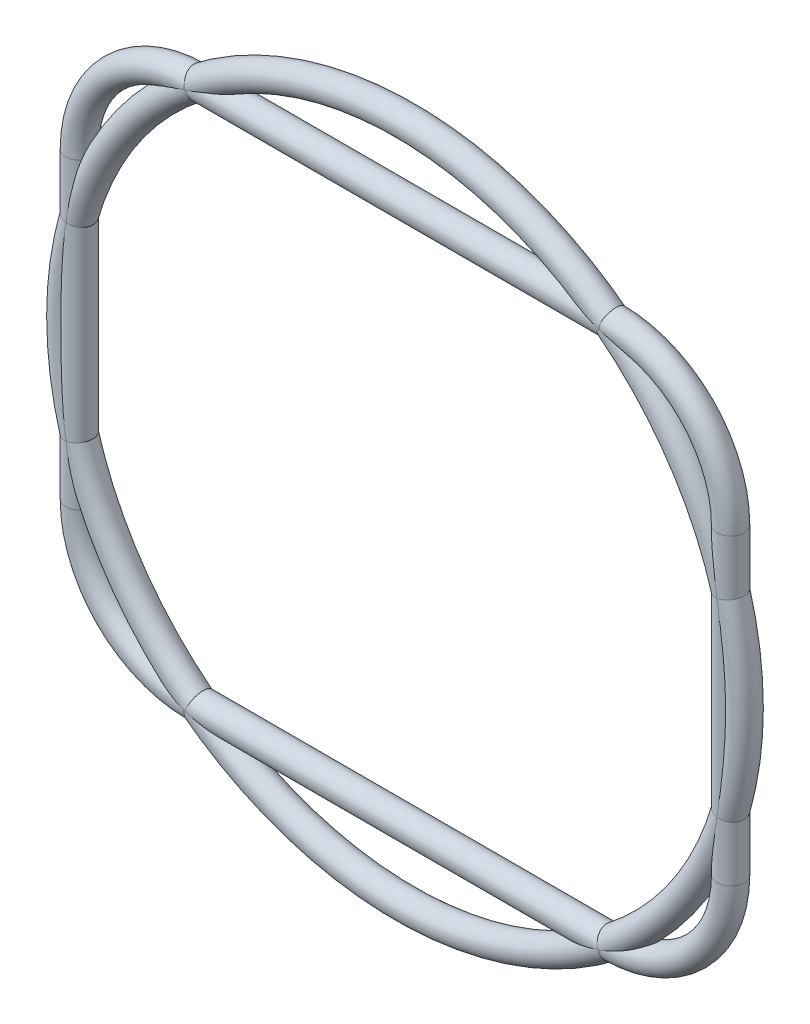
ISO-10303-21;
HEADER;
FILE_DESCRIPTION(('STEP AP214'),'2;1');
FILE_NAME('part.step','',(''),(''),'','','');
FILE_SCHEMA(('AUTOMOTIVE_DESIGN { 1 0 10303 214 1 1 1 1 }'));
ENDSEC;
DATA;
#1=APPLICATION_CONTEXT('core data for automotive mechanical design processes');
#2=APPLICATION_PROTOCOL_DEFINITION('international standard','automotive_design',2000,#1);
#3=PRODUCT_CONTEXT('',#1,'mechanical');
#4=PRODUCT('Part','Part','',(#3));
#5=PRODUCT_RELATED_PRODUCT_CATEGORY('part','',(#4));
#6=PRODUCT_DEFINITION_FORMATION('','',#4);
#7=PRODUCT_DEFINITION_CONTEXT('part definition',#1,'design');
#8=PRODUCT_DEFINITION('design','',#6,#7);
#9=PRODUCT_DEFINITION_SHAPE('','',#8);
#10=(LENGTH_UNIT() NAMED_UNIT(*) SI_UNIT(.MILLI.,.METRE.));
#11=(NAMED_UNIT(*) PLANE_ANGLE_UNIT() SI_UNIT($,.RADIAN.));
#12=(NAMED_UNIT(*) SI_UNIT($,.STERADIAN.) SOLID_ANGLE_UNIT());
#13=UNCERTAINTY_MEASURE_WITH_UNIT(LENGTH_MEASURE(1.E-05),#10,'distance_accuracy_value','');
#14=(GEOMETRIC_REPRESENTATION_CONTEXT(3) GLOBAL_UNCERTAINTY_ASSIGNED_CONTEXT((#13)) GLOBAL_UNIT_ASSIGNED_CONTEXT((#10,
#11,#12)) REPRESENTATION_CONTEXT('',''));
#15=CARTESIAN_POINT('',(0.,0.,0.));
#16=DIRECTION('',(0.,0.,1.));
#17=DIRECTION('',(1.,0.,0.));
#18=AXIS2_PLACEMENT_3D('',#15,#16,#17);
#19=CARTESIAN_POINT('',(-23.,16.75,0.));
#20=DIRECTION('',(0.,0.,-1.));
#21=DIRECTION('',(-1.,0.,0.));
#22=AXIS2_PLACEMENT_3D('',#19,#20,#21);
#23=TOROIDAL_SURFACE('',#22,13.,1.5);
#24=CARTESIAN_POINT('',(-36.,16.7499999999999,0.));
#25=DIRECTION('',(0.,1.,0.));
#26=DIRECTION('',(0.,0.,-1.));
#27=AXIS2_PLACEMENT_3D('',#24,#25,#26);
#28=CIRCLE('',#27,1.5);
#29=CARTESIAN_POINT('',(-37.5,16.7499999999999,0.));
#30=VERTEX_POINT('',#29);
#31=EDGE_CURVE('E52',#30,#30,#28,.T.);
#32=CARTESIAN_POINT('',(-22.9999999999999,29.75,0.));
#33=DIRECTION('',(1.,0.,0.));
#34=DIRECTION('',(0.,0.,-1.));
#35=AXIS2_PLACEMENT_3D('',#32,#33,#34);
#36=CIRCLE('',#35,1.5);
#37=CARTESIAN_POINT('',(-22.9999999999999,31.25,0.));
#38=VERTEX_POINT('',#37);
#39=EDGE_CURVE('E11',#38,#38,#36,.T.);
#40=CARTESIAN_POINT('',(-23.,16.75,0.));
#41=DIRECTION('',(0.,0.,-1.));
#42=DIRECTION('',(-1.,0.,0.));
#43=AXIS2_PLACEMENT_3D('',#40,#41,#42);
#44=CIRCLE('',#43,14.5);
#45=EDGE_CURVE('',#30,#38,#44,.T.);
#46=ORIENTED_EDGE('',*,*,#31,.T.);
#47=ORIENTED_EDGE('',*,*,#39,.F.);
#48=ORIENTED_EDGE('',*,*,#45,.T.);
#49=ORIENTED_EDGE('',*,*,#45,.F.);
#50=EDGE_LOOP('',(#46,#48,#47,#49));
#51=FACE_BOUND('',#50,.T.);
#52=ADVANCED_FACE('F46',(#51),#23,.T.);
#53=CARTESIAN_POINT('',(-36.,-16.7499999999999,0.));
#54=DIRECTION('',(0.,1.,0.));
#55=DIRECTION('',(0.,0.,1.));
#56=AXIS2_PLACEMENT_3D('',#53,#54,#55);
#57=CYLINDRICAL_SURFACE('',#56,1.5);
#58=CARTESIAN_POINT('',(-36.,-16.7499999999999,0.));
#59=DIRECTION('',(0.,1.,0.));
#60=DIRECTION('',(0.,0.,-1.));
#61=AXIS2_PLACEMENT_3D('',#58,#59,#60);
#62=CIRCLE('',#61,1.5);
#63=CARTESIAN_POINT('',(-37.5,-16.7499999999999,0.));
#64=VERTEX_POINT('',#63);
#65=EDGE_CURVE('E56',#64,#64,#62,.T.);
#66=ORIENTED_EDGE('',*,*,#65,.T.);
#67=EDGE_LOOP('',(#66));
#68=FACE_BOUND('',#67,.T.);
#69=ORIENTED_EDGE('',*,*,#31,.F.);
#70=EDGE_LOOP('',(#69));
#71=FACE_BOUND('',#70,.T.);
#72=ADVANCED_FACE('F90',(#68,#71),#57,.T.);
#73=CARTESIAN_POINT('',(-23.,-16.75,0.));
#74=DIRECTION('',(0.,0.,-1.));
#75=DIRECTION('',(-1.,0.,0.));
#76=AXIS2_PLACEMENT_3D('',#73,#74,#75);
#77=TOROIDAL_SURFACE('',#76,13.,1.5);
#78=CARTESIAN_POINT('',(-22.9999999999999,-29.75,0.));
#79=DIRECTION('',(-1.,0.,0.));
#80=DIRECTION('',(0.,0.,-1.));
#81=AXIS2_PLACEMENT_3D('',#78,#79,#80);
#82=CIRCLE('',#81,1.5);
#83=CARTESIAN_POINT('',(-22.9999999999999,-31.25,0.));
#84=VERTEX_POINT('',#83);
#85=EDGE_CURVE('E60',#84,#84,#82,.T.);
#86=CARTESIAN_POINT('',(-23.,-16.75,0.));
#87=DIRECTION('',(0.,0.,-1.));
#88=DIRECTION('',(-1.,0.,0.));
#89=AXIS2_PLACEMENT_3D('',#86,#87,#88);
#90=CIRCLE('',#89,14.5);
#91=EDGE_CURVE('',#84,#64,#90,.T.);
#92=ORIENTED_EDGE('',*,*,#85,.T.);
#93=ORIENTED_EDGE('',*,*,#65,.F.);
#94=ORIENTED_EDGE('',*,*,#91,.T.);
#95=ORIENTED_EDGE('',*,*,#91,.F.);
#96=EDGE_LOOP('',(#92,#94,#93,#95));
#97=FACE_BOUND('',#96,.T.);
#98=ADVANCED_FACE('F94',(#97),#77,.T.);
#99=CARTESIAN_POINT('',(22.9999999999999,-29.75,0.));
#100=DIRECTION('',(-1.,0.,0.));
#101=DIRECTION('',(0.,0.,1.));
#102=AXIS2_PLACEMENT_3D('',#99,#100,#101);
#103=CYLINDRICAL_SURFACE('',#102,1.5);
#104=CARTESIAN_POINT('',(22.9999999999999,-29.75,0.));
#105=DIRECTION('',(-1.,0.,0.));
#106=DIRECTION('',(0.,0.,-1.));
#107=AXIS2_PLACEMENT_3D('',#104,#105,#106);
#108=CIRCLE('',#107,1.5);
#109=CARTESIAN_POINT('',(22.9999999999999,-31.25,0.));
#110=VERTEX_POINT('',#109);
#111=EDGE_CURVE('E65',#110,#110,#108,.T.);
#112=ORIENTED_EDGE('',*,*,#111,.T.);
#113=EDGE_LOOP('',(#112));
#114=FACE_BOUND('',#113,.T.);
#115=ORIENTED_EDGE('',*,*,#85,.F.);
#116=EDGE_LOOP('',(#115));
#117=FACE_BOUND('',#116,.T.);
#118=ADVANCED_FACE('F100',(#114,#117),#103,.T.);
#119=CARTESIAN_POINT('',(23.,-16.75,0.));
#120=DIRECTION('',(0.,0.,-1.));
#121=DIRECTION('',(-1.,0.,0.));
#122=AXIS2_PLACEMENT_3D('',#119,#120,#121);
#123=TOROIDAL_SURFACE('',#122,13.,1.5);
#124=CARTESIAN_POINT('',(36.,-16.7499999999999,0.));
#125=DIRECTION('',(0.,-1.,0.));
#126=DIRECTION('',(0.,0.,-1.));
#127=AXIS2_PLACEMENT_3D('',#124,#125,#126);
#128=CIRCLE('',#127,1.5);
#129=CARTESIAN_POINT('',(37.5,-16.7499999999999,0.));
#130=VERTEX_POINT('',#129);
#131=EDGE_CURVE('E68',#130,#130,#128,.T.);
#132=CARTESIAN_POINT('',(23.,-16.75,0.));
#133=DIRECTION('',(0.,0.,-1.));
#134=DIRECTION('',(-1.,0.,0.));
#135=AXIS2_PLACEMENT_3D('',#132,#133,#134);
#136=CIRCLE('',#135,14.5);
#137=EDGE_CURVE('',#130,#110,#136,.T.);
#138=ORIENTED_EDGE('',*,*,#131,.T.);
#139=ORIENTED_EDGE('',*,*,#111,.F.);
#140=ORIENTED_EDGE('',*,*,#137,.T.);
#141=ORIENTED_EDGE('',*,*,#137,.F.);
#142=EDGE_LOOP('',(#138,#140,#139,#141));
#143=FACE_BOUND('',#142,.T.);
#144=ADVANCED_FACE('F107',(#143),#123,.T.);
#145=CARTESIAN_POINT('',(36.,16.7499999999999,0.));
#146=DIRECTION('',(0.,-1.,0.));
#147=DIRECTION('',(0.,0.,-1.));
#148=AXIS2_PLACEMENT_3D('',#145,#146,#147);
#149=CYLINDRICAL_SURFACE('',#148,1.5);
#150=CARTESIAN_POINT('',(36.,16.7499999999999,0.));
#151=DIRECTION('',(0.,-1.,0.));
#152=DIRECTION('',(0.,0.,-1.));
#153=AXIS2_PLACEMENT_3D('',#150,#151,#152);
#154=CIRCLE('',#153,1.5);
#155=CARTESIAN_POINT('',(37.5,16.7499999999999,0.));
#156=VERTEX_POINT('',#155);
#157=EDGE_CURVE('E71',#156,#156,#154,.T.);
#158=ORIENTED_EDGE('',*,*,#157,.T.);
#159=EDGE_LOOP('',(#158));
#160=FACE_BOUND('',#159,.T.);
#161=ORIENTED_EDGE('',*,*,#131,.F.);
#162=EDGE_LOOP('',(#161));
#163=FACE_BOUND('',#162,.T.);
#164=ADVANCED_FACE('F87',(#160,#163),#149,.T.);
#165=CARTESIAN_POINT('',(23.,16.75,0.));
#166=DIRECTION('',(0.,0.,-1.));
#167=DIRECTION('',(-1.,0.,0.));
#168=AXIS2_PLACEMENT_3D('',#165,#166,#167);
#169=TOROIDAL_SURFACE('',#168,13.,1.5);
#170=CARTESIAN_POINT('',(22.9999999999999,29.75,0.));
#171=DIRECTION('',(1.,0.,0.));
#172=DIRECTION('',(0.,0.,-1.));
#173=AXIS2_PLACEMENT_3D('',#170,#171,#172);
#174=CIRCLE('',#173,1.5);
#175=CARTESIAN_POINT('',(22.9999999999999,31.25,0.));
#176=VERTEX_POINT('',#175);
#177=EDGE_CURVE('E74',#176,#176,#174,.T.);
#178=CARTESIAN_POINT('',(23.,16.75,0.));
#179=DIRECTION('',(0.,0.,-1.));
#180=DIRECTION('',(-1.,0.,0.));
#181=AXIS2_PLACEMENT_3D('',#178,#179,#180);
#182=CIRCLE('',#181,14.5);
#183=EDGE_CURVE('',#176,#156,#182,.T.);
#184=ORIENTED_EDGE('',*,*,#177,.T.);
#185=ORIENTED_EDGE('',*,*,#157,.F.);
#186=ORIENTED_EDGE('',*,*,#183,.T.);
#187=ORIENTED_EDGE('',*,*,#183,.F.);
#188=EDGE_LOOP('',(#184,#186,#185,#187));
#189=FACE_BOUND('',#188,.T.);
#190=ADVANCED_FACE('F78',(#189),#169,.T.);
#191=CARTESIAN_POINT('',(22.9999999999999,29.75,0.));
#192=DIRECTION('',(-1.,0.,0.));
#193=DIRECTION('',(0.,0.,1.));
#194=AXIS2_PLACEMENT_3D('',#191,#192,#193);
#195=CYLINDRICAL_SURFACE('',#194,1.5);
#196=ORIENTED_EDGE('',*,*,#177,.F.);
#197=EDGE_LOOP('',(#196));
#198=FACE_BOUND('',#197,.T.);
#199=ORIENTED_EDGE('',*,*,#39,.T.);
#200=EDGE_LOOP('',(#199));
#201=FACE_BOUND('',#200,.T.);
#202=ADVANCED_FACE('F81',(#198,#201),#195,.T.);
#203=CLOSED_SHELL('',(#52,#72,#98,#118,#144,#164,#190,#202));
#204=MANIFOLD_SOLID_BREP('B2',#203);
#205=CARTESIAN_POINT('',(0.,0.,0.));
#206=DIRECTION('',(0.,0.,1.));
#207=DIRECTION('',(1.,0.,0.));
#208=AXIS2_PLACEMENT_3D('',#205,#206,#207);
#209=TOROIDAL_SURFACE('',#208,37.5,1.5);
#210=CARTESIAN_POINT('',(39.,0.,0.));
#211=VERTEX_POINT('',#210);
#212=VERTEX_LOOP('',#211);
#213=FACE_BOUND('',#212,.T.);
#214=ADVANCED_FACE('F170',(#213),#209,.T.);
#215=CLOSED_SHELL('',(#214));
#216=MANIFOLD_SOLID_BREP('B6_NOT_SHOWN',#215);
#217=ADVANCED_BREP_SHAPE_REPRESENTATION('',(#18,#204,#216),#14);
#218=SHAPE_DEFINITION_REPRESENTATION(#9,#217);
ENDSEC;
END-ISO-10303-21;
